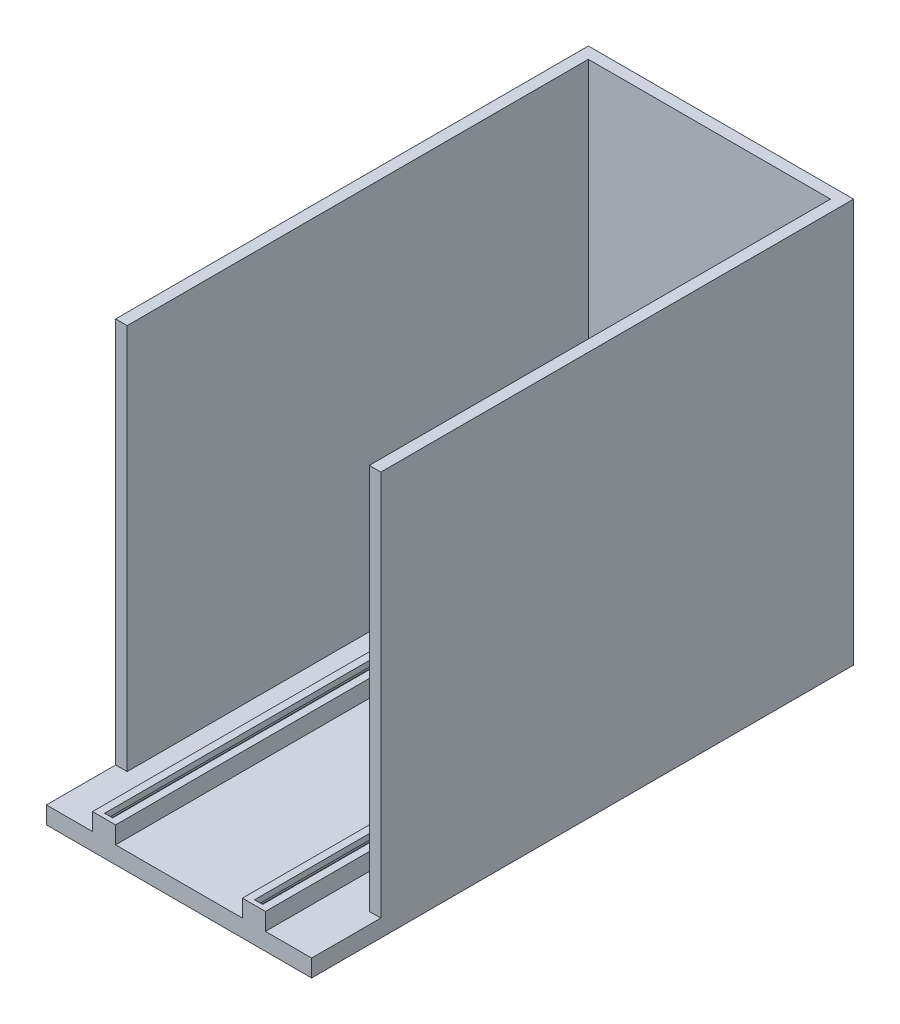
ISO-10303-21;
HEADER;
FILE_DESCRIPTION(('STEP AP214'),'2;1');
FILE_NAME('part.step','',(''),(''),'','','');
FILE_SCHEMA(('AUTOMOTIVE_DESIGN { 1 0 10303 214 1 1 1 1 }'));
ENDSEC;
DATA;
#1=APPLICATION_CONTEXT('core data for automotive mechanical design processes');
#2=APPLICATION_PROTOCOL_DEFINITION('international standard','automotive_design',2000,#1);
#3=PRODUCT_CONTEXT('',#1,'mechanical');
#4=PRODUCT('Part','Part','',(#3));
#5=PRODUCT_RELATED_PRODUCT_CATEGORY('part','',(#4));
#6=PRODUCT_DEFINITION_FORMATION('','',#4);
#7=PRODUCT_DEFINITION_CONTEXT('part definition',#1,'design');
#8=PRODUCT_DEFINITION('design','',#6,#7);
#9=PRODUCT_DEFINITION_SHAPE('','',#8);
#10=(LENGTH_UNIT() NAMED_UNIT(*) SI_UNIT(.MILLI.,.METRE.));
#11=(NAMED_UNIT(*) PLANE_ANGLE_UNIT() SI_UNIT($,.RADIAN.));
#12=(NAMED_UNIT(*) SI_UNIT($,.STERADIAN.) SOLID_ANGLE_UNIT());
#13=UNCERTAINTY_MEASURE_WITH_UNIT(LENGTH_MEASURE(1.E-05),#10,'distance_accuracy_value','');
#14=(GEOMETRIC_REPRESENTATION_CONTEXT(3) GLOBAL_UNCERTAINTY_ASSIGNED_CONTEXT((#13)) GLOBAL_UNIT_ASSIGNED_CONTEXT((#10,
#11,#12)) REPRESENTATION_CONTEXT('',''));
#15=CARTESIAN_POINT('',(0.,0.,0.));
#16=DIRECTION('',(0.,0.,1.));
#17=DIRECTION('',(1.,0.,0.));
#18=AXIS2_PLACEMENT_3D('',#15,#16,#17);
#19=CARTESIAN_POINT('',(90.1700000000001,38.1,-204.47));
#20=DIRECTION('',(0.,0.,-1.));
#21=DIRECTION('',(-1.,0.,0.));
#22=AXIS2_PLACEMENT_3D('',#19,#20,#21);
#23=PLANE('',#22);
#24=DIRECTION('',(-1.,0.,0.));
#25=VECTOR('',#24,1.);
#26=CARTESIAN_POINT('',(78.105,31.75,-204.47));
#27=LINE('',#26,#25);
#28=CARTESIAN_POINT('',(78.105,31.7499999999999,-204.47));
#29=VERTEX_POINT('',#28);
#30=CARTESIAN_POINT('',(74.9299999999999,31.75,-204.47));
#31=VERTEX_POINT('',#30);
#32=EDGE_CURVE('E265',#29,#31,#27,.T.);
#33=ORIENTED_EDGE('',*,*,#32,.T.);
#34=DIRECTION('',(0.,-1.,0.));
#35=VECTOR('',#34,1.);
#36=CARTESIAN_POINT('',(74.9299999999999,38.1,-204.47));
#37=LINE('',#36,#35);
#38=CARTESIAN_POINT('',(74.9299999999999,26.67,-204.47));
#39=VERTEX_POINT('',#38);
#40=EDGE_CURVE('E320',#31,#39,#37,.T.);
#41=ORIENTED_EDGE('',*,*,#40,.T.);
#42=DIRECTION('',(1.,0.,0.));
#43=VECTOR('',#42,1.);
#44=CARTESIAN_POINT('',(90.1700000000001,26.67,-204.47));
#45=LINE('',#44,#43);
#46=CARTESIAN_POINT('',(90.1700000000001,26.67,-204.47));
#47=VERTEX_POINT('',#46);
#48=EDGE_CURVE('E301',#39,#47,#45,.T.);
#49=ORIENTED_EDGE('',*,*,#48,.T.);
#50=DIRECTION('',(0.,-1.,0.));
#51=VECTOR('',#50,1.);
#52=CARTESIAN_POINT('',(90.1700000000001,38.1,-204.47));
#53=LINE('',#52,#51);
#54=CARTESIAN_POINT('',(90.1700000000001,31.75,-204.47));
#55=VERTEX_POINT('',#54);
#56=EDGE_CURVE('E306',#55,#47,#53,.T.);
#57=ORIENTED_EDGE('',*,*,#56,.F.);
#58=DIRECTION('',(1.,0.,0.));
#59=VECTOR('',#58,1.);
#60=CARTESIAN_POINT('',(86.9950000000001,31.75,-204.47));
#61=LINE('',#60,#59);
#62=CARTESIAN_POINT('',(86.9950000000001,31.75,-204.47));
#63=VERTEX_POINT('',#62);
#64=EDGE_CURVE('E299',#63,#55,#61,.T.);
#65=ORIENTED_EDGE('',*,*,#64,.F.);
#66=DIRECTION('',(0.,1.,0.));
#67=VECTOR('',#66,1.);
#68=CARTESIAN_POINT('',(86.9950000000001,38.1,-204.47));
#69=LINE('',#68,#67);
#70=CARTESIAN_POINT('',(86.9950000000001,38.1,-204.47));
#71=VERTEX_POINT('',#70);
#72=EDGE_CURVE('E289',#63,#71,#69,.T.);
#73=ORIENTED_EDGE('',*,*,#72,.T.);
#74=DIRECTION('',(1.,0.,0.));
#75=VECTOR('',#74,1.);
#76=CARTESIAN_POINT('',(90.1700000000001,38.1,-204.47));
#77=LINE('',#76,#75);
#78=CARTESIAN_POINT('',(78.105,38.1,-204.47));
#79=VERTEX_POINT('',#78);
#80=EDGE_CURVE('E55',#79,#71,#77,.T.);
#81=ORIENTED_EDGE('',*,*,#80,.F.);
#82=DIRECTION('',(0.,1.,0.));
#83=VECTOR('',#82,1.);
#84=CARTESIAN_POINT('',(78.105,38.1,-204.47));
#85=LINE('',#84,#83);
#86=EDGE_CURVE('E50',#29,#79,#85,.T.);
#87=ORIENTED_EDGE('',*,*,#86,.F.);
#88=EDGE_LOOP('',(#33,#41,#49,#57,#65,#73,#81,#87));
#89=FACE_BOUND('',#88,.T.);
#90=ADVANCED_FACE('F35',(#89),#23,.F.);
#91=CARTESIAN_POINT('',(74.9299999999999,38.1,-204.47));
#92=DIRECTION('',(-1.,0.,0.));
#93=DIRECTION('',(0.,0.,1.));
#94=AXIS2_PLACEMENT_3D('',#91,#92,#93);
#95=PLANE('',#94);
#96=DIRECTION('',(0.,0.,-1.));
#97=VECTOR('',#96,1.);
#98=CARTESIAN_POINT('',(74.93,31.75,-204.47));
#99=LINE('',#98,#97);
#100=CARTESIAN_POINT('',(74.9299999999999,31.7499999999999,293.37));
#101=VERTEX_POINT('',#100);
#102=EDGE_CURVE('E276',#101,#31,#99,.T.);
#103=ORIENTED_EDGE('',*,*,#102,.F.);
#104=DIRECTION('',(0.,-1.,0.));
#105=VECTOR('',#104,1.);
#106=CARTESIAN_POINT('',(74.9299999999999,38.1,293.37));
#107=LINE('',#106,#105);
#108=CARTESIAN_POINT('',(74.9299999999999,26.67,293.37));
#109=VERTEX_POINT('',#108);
#110=EDGE_CURVE('E261',#101,#109,#107,.T.);
#111=ORIENTED_EDGE('',*,*,#110,.T.);
#112=DIRECTION('',(0.,0.,-1.));
#113=VECTOR('',#112,1.);
#114=CARTESIAN_POINT('',(74.9299999999999,26.67,-204.47));
#115=LINE('',#114,#113);
#116=EDGE_CURVE('E309',#109,#39,#115,.T.);
#117=ORIENTED_EDGE('',*,*,#116,.T.);
#118=ORIENTED_EDGE('',*,*,#40,.F.);
#119=EDGE_LOOP('',(#103,#111,#117,#118));
#120=FACE_BOUND('',#119,.T.);
#121=ADVANCED_FACE('F578',(#120),#95,.F.);
#122=CARTESIAN_POINT('',(74.9299999999999,38.1,293.37));
#123=DIRECTION('',(0.,0.,1.));
#124=DIRECTION('',(1.,0.,0.));
#125=AXIS2_PLACEMENT_3D('',#122,#123,#124);
#126=PLANE('',#125);
#127=DIRECTION('',(-1.,0.,0.));
#128=VECTOR('',#127,1.);
#129=CARTESIAN_POINT('',(78.1050000000001,31.7499999999999,293.37));
#130=LINE('',#129,#128);
#131=CARTESIAN_POINT('',(78.1050000000001,31.7499999999999,293.37));
#132=VERTEX_POINT('',#131);
#133=EDGE_CURVE('E253',#132,#101,#130,.T.);
#134=ORIENTED_EDGE('',*,*,#133,.F.);
#135=DIRECTION('',(0.,-1.,0.));
#136=VECTOR('',#135,1.);
#137=CARTESIAN_POINT('',(78.1050000000001,31.7499999999999,293.37));
#138=LINE('',#137,#136);
#139=CARTESIAN_POINT('',(78.1050000000001,38.1,293.37));
#140=VERTEX_POINT('',#139);
#141=EDGE_CURVE('E258',#140,#132,#138,.T.);
#142=ORIENTED_EDGE('',*,*,#141,.F.);
#143=DIRECTION('',(-1.,0.,0.));
#144=VECTOR('',#143,1.);
#145=CARTESIAN_POINT('',(74.9299999999999,38.1,293.37));
#146=LINE('',#145,#144);
#147=CARTESIAN_POINT('',(86.9950000000001,38.1,293.37));
#148=VERTEX_POINT('',#147);
#149=EDGE_CURVE('E303',#148,#140,#146,.T.);
#150=ORIENTED_EDGE('',*,*,#149,.F.);
#151=DIRECTION('',(0.,-1.,0.));
#152=VECTOR('',#151,1.);
#153=CARTESIAN_POINT('',(86.9950000000001,31.7499999999999,293.37));
#154=LINE('',#153,#152);
#155=CARTESIAN_POINT('',(86.9950000000001,31.7499999999999,293.37));
#156=VERTEX_POINT('',#155);
#157=EDGE_CURVE('E283',#148,#156,#154,.T.);
#158=ORIENTED_EDGE('',*,*,#157,.T.);
#159=DIRECTION('',(1.,0.,0.));
#160=VECTOR('',#159,1.);
#161=CARTESIAN_POINT('',(86.9950000000001,31.7499999999999,293.37));
#162=LINE('',#161,#160);
#163=CARTESIAN_POINT('',(90.1700000000001,31.7499999999999,293.37));
#164=VERTEX_POINT('',#163);
#165=EDGE_CURVE('E294',#156,#164,#162,.T.);
#166=ORIENTED_EDGE('',*,*,#165,.T.);
#167=DIRECTION('',(0.,-1.,0.));
#168=VECTOR('',#167,1.);
#169=CARTESIAN_POINT('',(90.1700000000001,38.1,293.37));
#170=LINE('',#169,#168);
#171=CARTESIAN_POINT('',(90.1700000000001,26.67,293.37));
#172=VERTEX_POINT('',#171);
#173=EDGE_CURVE('E317',#164,#172,#170,.T.);
#174=ORIENTED_EDGE('',*,*,#173,.T.);
#175=DIRECTION('',(-1.,0.,0.));
#176=VECTOR('',#175,1.);
#177=CARTESIAN_POINT('',(74.9299999999999,26.67,293.37));
#178=LINE('',#177,#176);
#179=EDGE_CURVE('E312',#172,#109,#178,.T.);
#180=ORIENTED_EDGE('',*,*,#179,.T.);
#181=ORIENTED_EDGE('',*,*,#110,.F.);
#182=EDGE_LOOP('',(#134,#142,#150,#158,#166,#174,#180,#181));
#183=FACE_BOUND('',#182,.T.);
#184=ADVANCED_FACE('F255',(#183),#126,.F.);
#185=CARTESIAN_POINT('',(-90.1700000000001,38.1,-204.47));
#186=DIRECTION('',(0.,0.,1.));
#187=DIRECTION('',(1.,0.,0.));
#188=AXIS2_PLACEMENT_3D('',#185,#186,#187);
#189=PLANE('',#188);
#190=DIRECTION('',(1.,0.,0.));
#191=VECTOR('',#190,1.);
#192=CARTESIAN_POINT('',(-78.1050000000001,31.75,-204.47));
#193=LINE('',#192,#191);
#194=CARTESIAN_POINT('',(-78.1050000000001,31.7499999999999,-204.47));
#195=VERTEX_POINT('',#194);
#196=CARTESIAN_POINT('',(-74.9299999999999,31.75,-204.47));
#197=VERTEX_POINT('',#196);
#198=EDGE_CURVE('E368',#195,#197,#193,.T.);
#199=ORIENTED_EDGE('',*,*,#198,.F.);
#200=DIRECTION('',(0.,1.,0.));
#201=VECTOR('',#200,1.);
#202=CARTESIAN_POINT('',(-78.1050000000001,38.1,-204.47));
#203=LINE('',#202,#201);
#204=CARTESIAN_POINT('',(-78.1050000000001,38.1,-204.47));
#205=VERTEX_POINT('',#204);
#206=EDGE_CURVE('E359',#195,#205,#203,.T.);
#207=ORIENTED_EDGE('',*,*,#206,.T.);
#208=DIRECTION('',(-1.,0.,0.));
#209=VECTOR('',#208,1.);
#210=CARTESIAN_POINT('',(-90.1700000000001,38.1,-204.47));
#211=LINE('',#210,#209);
#212=CARTESIAN_POINT('',(-86.9950000000001,38.1,-204.47));
#213=VERTEX_POINT('',#212);
#214=EDGE_CURVE('E389',#205,#213,#211,.T.);
#215=ORIENTED_EDGE('',*,*,#214,.T.);
#216=DIRECTION('',(0.,1.,0.));
#217=VECTOR('',#216,1.);
#218=CARTESIAN_POINT('',(-86.9950000000001,38.1,-204.47));
#219=LINE('',#218,#217);
#220=CARTESIAN_POINT('',(-86.9950000000001,31.75,-204.47));
#221=VERTEX_POINT('',#220);
#222=EDGE_CURVE('E377',#221,#213,#219,.T.);
#223=ORIENTED_EDGE('',*,*,#222,.F.);
#224=DIRECTION('',(-1.,0.,0.));
#225=VECTOR('',#224,1.);
#226=CARTESIAN_POINT('',(-86.9950000000001,31.75,-204.47));
#227=LINE('',#226,#225);
#228=CARTESIAN_POINT('',(-90.1700000000001,31.75,-204.47));
#229=VERTEX_POINT('',#228);
#230=EDGE_CURVE('E382',#221,#229,#227,.T.);
#231=ORIENTED_EDGE('',*,*,#230,.T.);
#232=DIRECTION('',(0.,-1.,0.));
#233=VECTOR('',#232,1.);
#234=CARTESIAN_POINT('',(-90.1700000000001,38.1,-204.47));
#235=LINE('',#234,#233);
#236=CARTESIAN_POINT('',(-90.1700000000001,26.67,-204.47));
#237=VERTEX_POINT('',#236);
#238=EDGE_CURVE('E410',#229,#237,#235,.T.);
#239=ORIENTED_EDGE('',*,*,#238,.T.);
#240=DIRECTION('',(-1.,0.,0.));
#241=VECTOR('',#240,1.);
#242=CARTESIAN_POINT('',(-90.1700000000001,26.67,-204.47));
#243=LINE('',#242,#241);
#244=CARTESIAN_POINT('',(-74.9299999999999,26.67,-204.47));
#245=VERTEX_POINT('',#244);
#246=EDGE_CURVE('E388',#245,#237,#243,.T.);
#247=ORIENTED_EDGE('',*,*,#246,.F.);
#248=DIRECTION('',(0.,-1.,0.));
#249=VECTOR('',#248,1.);
#250=CARTESIAN_POINT('',(-74.9299999999999,38.1,-204.47));
#251=LINE('',#250,#249);
#252=EDGE_CURVE('E394',#197,#245,#251,.T.);
#253=ORIENTED_EDGE('',*,*,#252,.F.);
#254=EDGE_LOOP('',(#199,#207,#215,#223,#231,#239,#247,#253));
#255=FACE_BOUND('',#254,.T.);
#256=ADVANCED_FACE('F638',(#255),#189,.T.);
#257=CARTESIAN_POINT('',(-90.1700000000001,38.1,-204.47));
#258=DIRECTION('',(1.,0.,0.));
#259=DIRECTION('',(0.,0.,-1.));
#260=AXIS2_PLACEMENT_3D('',#257,#258,#259);
#261=PLANE('',#260);
#262=ORIENTED_EDGE('',*,*,#238,.F.);
#263=DIRECTION('',(0.,0.,-1.));
#264=VECTOR('',#263,1.);
#265=CARTESIAN_POINT('',(-90.1700000000001,31.75,-204.47));
#266=LINE('',#265,#264);
#267=CARTESIAN_POINT('',(-90.1700000000001,31.7499999999999,293.37));
#268=VERTEX_POINT('',#267);
#269=EDGE_CURVE('E371',#268,#229,#266,.T.);
#270=ORIENTED_EDGE('',*,*,#269,.F.);
#271=DIRECTION('',(0.,-1.,0.));
#272=VECTOR('',#271,1.);
#273=CARTESIAN_POINT('',(-90.1700000000001,38.1,293.37));
#274=LINE('',#273,#272);
#275=CARTESIAN_POINT('',(-90.1700000000001,26.67,293.37));
#276=VERTEX_POINT('',#275);
#277=EDGE_CURVE('E408',#268,#276,#274,.T.);
#278=ORIENTED_EDGE('',*,*,#277,.T.);
#279=DIRECTION('',(0.,0.,1.));
#280=VECTOR('',#279,1.);
#281=CARTESIAN_POINT('',(-90.1700000000001,26.67,-204.47));
#282=LINE('',#281,#280);
#283=EDGE_CURVE('E397',#237,#276,#282,.T.);
#284=ORIENTED_EDGE('',*,*,#283,.F.);
#285=EDGE_LOOP('',(#262,#270,#278,#284));
#286=FACE_BOUND('',#285,.T.);
#287=ADVANCED_FACE('F634',(#286),#261,.T.);
#288=CARTESIAN_POINT('',(-74.9299999999999,38.1,293.37));
#289=DIRECTION('',(0.,0.,-1.));
#290=DIRECTION('',(-1.,0.,0.));
#291=AXIS2_PLACEMENT_3D('',#288,#289,#290);
#292=PLANE('',#291);
#293=DIRECTION('',(1.,0.,0.));
#294=VECTOR('',#293,1.);
#295=CARTESIAN_POINT('',(-78.105,31.7499999999999,293.37));
#296=LINE('',#295,#294);
#297=CARTESIAN_POINT('',(-78.105,31.7499999999999,293.37));
#298=VERTEX_POINT('',#297);
#299=CARTESIAN_POINT('',(-74.93,31.7499999999999,293.37));
#300=VERTEX_POINT('',#299);
#301=EDGE_CURVE('E364',#298,#300,#296,.T.);
#302=ORIENTED_EDGE('',*,*,#301,.T.);
#303=DIRECTION('',(0.,-1.,0.));
#304=VECTOR('',#303,1.);
#305=CARTESIAN_POINT('',(-74.9299999999999,38.1,293.37));
#306=LINE('',#305,#304);
#307=CARTESIAN_POINT('',(-74.9299999999999,26.67,293.37));
#308=VERTEX_POINT('',#307);
#309=EDGE_CURVE('E406',#300,#308,#306,.T.);
#310=ORIENTED_EDGE('',*,*,#309,.T.);
#311=DIRECTION('',(1.,0.,0.));
#312=VECTOR('',#311,1.);
#313=CARTESIAN_POINT('',(-74.9299999999999,26.67,293.37));
#314=LINE('',#313,#312);
#315=EDGE_CURVE('E400',#276,#308,#314,.T.);
#316=ORIENTED_EDGE('',*,*,#315,.F.);
#317=ORIENTED_EDGE('',*,*,#277,.F.);
#318=DIRECTION('',(-1.,0.,0.));
#319=VECTOR('',#318,1.);
#320=CARTESIAN_POINT('',(-86.9950000000001,31.7499999999999,293.37));
#321=LINE('',#320,#319);
#322=CARTESIAN_POINT('',(-86.9950000000001,31.7499999999999,293.37));
#323=VERTEX_POINT('',#322);
#324=EDGE_CURVE('E386',#323,#268,#321,.T.);
#325=ORIENTED_EDGE('',*,*,#324,.F.);
#326=DIRECTION('',(0.,-1.,0.));
#327=VECTOR('',#326,1.);
#328=CARTESIAN_POINT('',(-86.9950000000001,31.7499999999999,293.37));
#329=LINE('',#328,#327);
#330=CARTESIAN_POINT('',(-86.9950000000001,38.1,293.37));
#331=VERTEX_POINT('',#330);
#332=EDGE_CURVE('E372',#331,#323,#329,.T.);
#333=ORIENTED_EDGE('',*,*,#332,.F.);
#334=DIRECTION('',(1.,0.,0.));
#335=VECTOR('',#334,1.);
#336=CARTESIAN_POINT('',(-74.9299999999999,38.1,293.37));
#337=LINE('',#336,#335);
#338=CARTESIAN_POINT('',(-78.1050000000001,38.1,293.37));
#339=VERTEX_POINT('',#338);
#340=EDGE_CURVE('E391',#331,#339,#337,.T.);
#341=ORIENTED_EDGE('',*,*,#340,.T.);
#342=DIRECTION('',(0.,-1.,0.));
#343=VECTOR('',#342,1.);
#344=CARTESIAN_POINT('',(-78.105,31.7499999999999,293.37));
#345=LINE('',#344,#343);
#346=EDGE_CURVE('E354',#339,#298,#345,.T.);
#347=ORIENTED_EDGE('',*,*,#346,.T.);
#348=EDGE_LOOP('',(#302,#310,#316,#317,#325,#333,#341,#347));
#349=FACE_BOUND('',#348,.T.);
#350=ADVANCED_FACE('F631',(#349),#292,.T.);
#351=CARTESIAN_POINT('',(0.,19.05,0.));
#352=DIRECTION('',(0.,-1.,0.));
#353=DIRECTION('',(0.,0.,-1.));
#354=AXIS2_PLACEMENT_3D('',#351,#352,#353);
#355=PLANE('',#354);
#356=DIRECTION('',(1.,0.,0.));
#357=VECTOR('',#356,1.);
#358=CARTESIAN_POINT('',(69.8500000000001,19.05,-209.55));
#359=LINE('',#358,#357);
#360=CARTESIAN_POINT('',(69.8500000000001,19.05,-209.55));
#361=VERTEX_POINT('',#360);
#362=CARTESIAN_POINT('',(95.2500000000001,19.05,-209.55));
#363=VERTEX_POINT('',#362);
#364=EDGE_CURVE('E337',#361,#363,#359,.T.);
#365=ORIENTED_EDGE('',*,*,#364,.T.);
#366=DIRECTION('',(0.,0.,1.));
#367=VECTOR('',#366,1.);
#368=CARTESIAN_POINT('',(95.2500000000001,19.05,-209.55));
#369=LINE('',#368,#367);
#370=CARTESIAN_POINT('',(95.25,19.05,298.45));
#371=VERTEX_POINT('',#370);
#372=EDGE_CURVE('E334',#363,#371,#369,.T.);
#373=ORIENTED_EDGE('',*,*,#372,.T.);
#374=DIRECTION('',(1.,0.,0.));
#375=VECTOR('',#374,1.);
#376=CARTESIAN_POINT('',(-146.05,19.05,298.45));
#377=LINE('',#376,#375);
#378=CARTESIAN_POINT('',(146.05,19.05,298.45));
#379=VERTEX_POINT('',#378);
#380=EDGE_CURVE('E503',#371,#379,#377,.T.);
#381=ORIENTED_EDGE('',*,*,#380,.T.);
#382=DIRECTION('',(0.,0.,-1.));
#383=VECTOR('',#382,1.);
#384=CARTESIAN_POINT('',(146.05,19.05,298.45));
#385=LINE('',#384,#383);
#386=CARTESIAN_POINT('',(146.05,19.05,222.25));
#387=VERTEX_POINT('',#386);
#388=EDGE_CURVE('E498',#379,#387,#385,.T.);
#389=ORIENTED_EDGE('',*,*,#388,.T.);
#390=DIRECTION('',(1.,0.,0.));
#391=VECTOR('',#390,1.);
#392=CARTESIAN_POINT('',(146.05,19.05,222.25));
#393=LINE('',#392,#391);
#394=CARTESIAN_POINT('',(133.35,19.05,222.25));
#395=VERTEX_POINT('',#394);
#396=EDGE_CURVE('E450',#395,#387,#393,.T.);
#397=ORIENTED_EDGE('',*,*,#396,.F.);
#398=DIRECTION('',(0.,0.,1.));
#399=VECTOR('',#398,1.);
#400=CARTESIAN_POINT('',(133.35,19.05,222.25));
#401=LINE('',#400,#399);
#402=CARTESIAN_POINT('',(133.35,19.05,-285.75));
#403=VERTEX_POINT('',#402);
#404=EDGE_CURVE('E475',#403,#395,#401,.T.);
#405=ORIENTED_EDGE('',*,*,#404,.F.);
#406=DIRECTION('',(1.,0.,0.));
#407=VECTOR('',#406,1.);
#408=CARTESIAN_POINT('',(133.35,19.05,-285.75));
#409=LINE('',#408,#407);
#410=CARTESIAN_POINT('',(-133.35,19.05,-285.75));
#411=VERTEX_POINT('',#410);
#412=EDGE_CURVE('E472',#411,#403,#409,.T.);
#413=ORIENTED_EDGE('',*,*,#412,.F.);
#414=DIRECTION('',(0.,0.,-1.));
#415=VECTOR('',#414,1.);
#416=CARTESIAN_POINT('',(-133.35,19.05,-285.75));
#417=LINE('',#416,#415);
#418=CARTESIAN_POINT('',(-133.35,19.05,222.25));
#419=VERTEX_POINT('',#418);
#420=EDGE_CURVE('E469',#419,#411,#417,.T.);
#421=ORIENTED_EDGE('',*,*,#420,.F.);
#422=DIRECTION('',(1.,0.,0.));
#423=VECTOR('',#422,1.);
#424=CARTESIAN_POINT('',(-133.35,19.05,222.25));
#425=LINE('',#424,#423);
#426=CARTESIAN_POINT('',(-146.05,19.05,222.25));
#427=VERTEX_POINT('',#426);
#428=EDGE_CURVE('E445',#427,#419,#425,.T.);
#429=ORIENTED_EDGE('',*,*,#428,.F.);
#430=DIRECTION('',(0.,0.,1.));
#431=VECTOR('',#430,1.);
#432=CARTESIAN_POINT('',(-146.05,19.05,298.45));
#433=LINE('',#432,#431);
#434=CARTESIAN_POINT('',(-146.05,19.05,298.45));
#435=VERTEX_POINT('',#434);
#436=EDGE_CURVE('E500',#427,#435,#433,.T.);
#437=ORIENTED_EDGE('',*,*,#436,.T.);
#438=CARTESIAN_POINT('',(-95.2500000000001,19.05,298.45));
#439=VERTEX_POINT('',#438);
#440=EDGE_CURVE('E504',#435,#439,#377,.T.);
#441=ORIENTED_EDGE('',*,*,#440,.T.);
#442=DIRECTION('',(0.,0.,1.));
#443=VECTOR('',#442,1.);
#444=CARTESIAN_POINT('',(-95.2500000000001,19.05,-209.55));
#445=LINE('',#444,#443);
#446=CARTESIAN_POINT('',(-95.2500000000001,19.05,-209.55));
#447=VERTEX_POINT('',#446);
#448=EDGE_CURVE('E430',#447,#439,#445,.T.);
#449=ORIENTED_EDGE('',*,*,#448,.F.);
#450=DIRECTION('',(-1.,0.,0.));
#451=VECTOR('',#450,1.);
#452=CARTESIAN_POINT('',(-69.8500000000001,19.05,-209.55));
#453=LINE('',#452,#451);
#454=CARTESIAN_POINT('',(-69.8500000000001,19.05,-209.55));
#455=VERTEX_POINT('',#454);
#456=EDGE_CURVE('E427',#455,#447,#453,.T.);
#457=ORIENTED_EDGE('',*,*,#456,.F.);
#458=DIRECTION('',(0.,0.,-1.));
#459=VECTOR('',#458,1.);
#460=CARTESIAN_POINT('',(-69.8500000000001,19.05,298.45));
#461=LINE('',#460,#459);
#462=CARTESIAN_POINT('',(-69.8500000000001,19.05,298.45));
#463=VERTEX_POINT('',#462);
#464=EDGE_CURVE('E424',#463,#455,#461,.T.);
#465=ORIENTED_EDGE('',*,*,#464,.F.);
#466=CARTESIAN_POINT('',(69.8500000000001,19.05,298.45));
#467=VERTEX_POINT('',#466);
#468=EDGE_CURVE('E507',#463,#467,#377,.T.);
#469=ORIENTED_EDGE('',*,*,#468,.T.);
#470=DIRECTION('',(0.,0.,-1.));
#471=VECTOR('',#470,1.);
#472=CARTESIAN_POINT('',(69.8500000000001,19.05,298.45));
#473=LINE('',#472,#471);
#474=EDGE_CURVE('E339',#467,#361,#473,.T.);
#475=ORIENTED_EDGE('',*,*,#474,.T.);
#476=EDGE_LOOP('',(#365,#373,#381,#389,#397,#405,#413,#421,#429,#437,#441,#449,#457,#465,#469,#475));
#477=FACE_BOUND('',#476,.T.);
#478=ADVANCED_FACE('F544',(#477),#355,.F.);
#479=CARTESIAN_POINT('',(146.05,19.05,298.45));
#480=DIRECTION('',(-1.,0.,0.));
#481=DIRECTION('',(0.,0.,1.));
#482=AXIS2_PLACEMENT_3D('',#479,#480,#481);
#483=PLANE('',#482);
#484=DIRECTION('',(0.,0.,-1.));
#485=VECTOR('',#484,1.);
#486=CARTESIAN_POINT('',(146.05,0.,298.45));
#487=LINE('',#486,#485);
#488=CARTESIAN_POINT('',(146.05,0.,298.45));
#489=VERTEX_POINT('',#488);
#490=CARTESIAN_POINT('',(146.05,0.,-298.45));
#491=VERTEX_POINT('',#490);
#492=EDGE_CURVE('E497',#489,#491,#487,.T.);
#493=ORIENTED_EDGE('',*,*,#492,.T.);
#494=DIRECTION('',(0.,-1.,0.));
#495=VECTOR('',#494,1.);
#496=CARTESIAN_POINT('',(146.05,19.05,-298.45));
#497=LINE('',#496,#495);
#498=CARTESIAN_POINT('',(146.05,444.5,-298.45));
#499=VERTEX_POINT('',#498);
#500=EDGE_CURVE('E11',#499,#491,#497,.T.);
#501=ORIENTED_EDGE('',*,*,#500,.F.);
#502=DIRECTION('',(0.,0.,-1.));
#503=VECTOR('',#502,1.);
#504=CARTESIAN_POINT('',(146.05,444.5,-298.45));
#505=LINE('',#504,#503);
#506=CARTESIAN_POINT('',(146.05,444.5,222.25));
#507=VERTEX_POINT('',#506);
#508=EDGE_CURVE('E458',#507,#499,#505,.T.);
#509=ORIENTED_EDGE('',*,*,#508,.F.);
#510=DIRECTION('',(0.,-1.,0.));
#511=VECTOR('',#510,1.);
#512=CARTESIAN_POINT('',(146.05,444.5,222.25));
#513=LINE('',#512,#511);
#514=EDGE_CURVE('E482',#507,#387,#513,.T.);
#515=ORIENTED_EDGE('',*,*,#514,.T.);
#516=ORIENTED_EDGE('',*,*,#388,.F.);
#517=DIRECTION('',(0.,-1.,0.));
#518=VECTOR('',#517,1.);
#519=CARTESIAN_POINT('',(146.05,19.05,298.45));
#520=LINE('',#519,#518);
#521=EDGE_CURVE('E506',#379,#489,#520,.T.);
#522=ORIENTED_EDGE('',*,*,#521,.T.);
#523=EDGE_LOOP('',(#493,#501,#509,#515,#516,#522));
#524=FACE_BOUND('',#523,.T.);
#525=ADVANCED_FACE('F37',(#524),#483,.F.);
#526=CARTESIAN_POINT('',(-146.05,19.05,-298.45));
#527=DIRECTION('',(0.,0.,1.));
#528=DIRECTION('',(1.,0.,0.));
#529=AXIS2_PLACEMENT_3D('',#526,#527,#528);
#530=PLANE('',#529);
#531=DIRECTION('',(-1.,0.,0.));
#532=VECTOR('',#531,1.);
#533=CARTESIAN_POINT('',(-146.05,0.,-298.45));
#534=LINE('',#533,#532);
#535=CARTESIAN_POINT('',(-146.05,0.,-298.45));
#536=VERTEX_POINT('',#535);
#537=EDGE_CURVE('E510',#491,#536,#534,.T.);
#538=ORIENTED_EDGE('',*,*,#537,.T.);
#539=DIRECTION('',(0.,-1.,0.));
#540=VECTOR('',#539,1.);
#541=CARTESIAN_POINT('',(-146.05,19.05,-298.45));
#542=LINE('',#541,#540);
#543=CARTESIAN_POINT('',(-146.05,444.5,-298.45));
#544=VERTEX_POINT('',#543);
#545=EDGE_CURVE('E43',#544,#536,#542,.T.);
#546=ORIENTED_EDGE('',*,*,#545,.F.);
#547=DIRECTION('',(-1.,0.,0.));
#548=VECTOR('',#547,1.);
#549=CARTESIAN_POINT('',(-146.05,444.5,-298.45));
#550=LINE('',#549,#548);
#551=EDGE_CURVE('E461',#499,#544,#550,.T.);
#552=ORIENTED_EDGE('',*,*,#551,.F.);
#553=ORIENTED_EDGE('',*,*,#500,.T.);
#554=EDGE_LOOP('',(#538,#546,#552,#553));
#555=FACE_BOUND('',#554,.T.);
#556=ADVANCED_FACE('F530',(#555),#530,.F.);
#557=CARTESIAN_POINT('',(-146.05,19.05,298.45));
#558=DIRECTION('',(1.,0.,0.));
#559=DIRECTION('',(0.,0.,-1.));
#560=AXIS2_PLACEMENT_3D('',#557,#558,#559);
#561=PLANE('',#560);
#562=ORIENTED_EDGE('',*,*,#436,.F.);
#563=DIRECTION('',(0.,-1.,0.));
#564=VECTOR('',#563,1.);
#565=CARTESIAN_POINT('',(-146.05,444.5,222.25));
#566=LINE('',#565,#564);
#567=CARTESIAN_POINT('',(-146.05,444.5,222.25));
#568=VERTEX_POINT('',#567);
#569=EDGE_CURVE('E466',#568,#427,#566,.T.);
#570=ORIENTED_EDGE('',*,*,#569,.F.);
#571=DIRECTION('',(0.,0.,1.));
#572=VECTOR('',#571,1.);
#573=CARTESIAN_POINT('',(-146.05,444.5,222.25));
#574=LINE('',#573,#572);
#575=EDGE_CURVE('E464',#544,#568,#574,.T.);
#576=ORIENTED_EDGE('',*,*,#575,.F.);
#577=ORIENTED_EDGE('',*,*,#545,.T.);
#578=DIRECTION('',(0.,0.,1.));
#579=VECTOR('',#578,1.);
#580=CARTESIAN_POINT('',(-146.05,0.,298.45));
#581=LINE('',#580,#579);
#582=CARTESIAN_POINT('',(-146.05,0.,298.45));
#583=VERTEX_POINT('',#582);
#584=EDGE_CURVE('E513',#536,#583,#581,.T.);
#585=ORIENTED_EDGE('',*,*,#584,.T.);
#586=DIRECTION('',(0.,-1.,0.));
#587=VECTOR('',#586,1.);
#588=CARTESIAN_POINT('',(-146.05,19.05,298.45));
#589=LINE('',#588,#587);
#590=EDGE_CURVE('E518',#435,#583,#589,.T.);
#591=ORIENTED_EDGE('',*,*,#590,.F.);
#592=EDGE_LOOP('',(#562,#570,#576,#577,#585,#591));
#593=FACE_BOUND('',#592,.T.);
#594=ADVANCED_FACE('F523',(#593),#561,.F.);
#595=CARTESIAN_POINT('',(-146.05,19.05,298.45));
#596=DIRECTION('',(0.,0.,-1.));
#597=DIRECTION('',(-1.,0.,0.));
#598=AXIS2_PLACEMENT_3D('',#595,#596,#597);
#599=PLANE('',#598);
#600=ORIENTED_EDGE('',*,*,#468,.F.);
#601=DIRECTION('',(0.,-1.,0.));
#602=VECTOR('',#601,1.);
#603=CARTESIAN_POINT('',(-69.8500000000001,26.67,298.45));
#604=LINE('',#603,#602);
#605=CARTESIAN_POINT('',(-69.85,38.1,298.45));
#606=VERTEX_POINT('',#605);
#607=EDGE_CURVE('E442',#606,#463,#604,.T.);
#608=ORIENTED_EDGE('',*,*,#607,.F.);
#609=DIRECTION('',(1.,0.,0.));
#610=VECTOR('',#609,1.);
#611=CARTESIAN_POINT('',(-95.25,38.1,298.45));
#612=LINE('',#611,#610);
#613=CARTESIAN_POINT('',(-95.25,38.1,298.45));
#614=VERTEX_POINT('',#613);
#615=EDGE_CURVE('E418',#614,#606,#612,.T.);
#616=ORIENTED_EDGE('',*,*,#615,.F.);
#617=DIRECTION('',(0.,-1.,0.));
#618=VECTOR('',#617,1.);
#619=CARTESIAN_POINT('',(-95.25,26.67,298.45));
#620=LINE('',#619,#618);
#621=EDGE_CURVE('E433',#614,#439,#620,.T.);
#622=ORIENTED_EDGE('',*,*,#621,.T.);
#623=ORIENTED_EDGE('',*,*,#440,.F.);
#624=ORIENTED_EDGE('',*,*,#590,.T.);
#625=DIRECTION('',(1.,0.,0.));
#626=VECTOR('',#625,1.);
#627=CARTESIAN_POINT('',(-146.05,0.,298.45));
#628=LINE('',#627,#626);
#629=EDGE_CURVE('E501',#583,#489,#628,.T.);
#630=ORIENTED_EDGE('',*,*,#629,.T.);
#631=ORIENTED_EDGE('',*,*,#521,.F.);
#632=ORIENTED_EDGE('',*,*,#380,.F.);
#633=DIRECTION('',(0.,-1.,0.));
#634=VECTOR('',#633,1.);
#635=CARTESIAN_POINT('',(95.25,26.67,298.45));
#636=LINE('',#635,#634);
#637=CARTESIAN_POINT('',(95.25,38.1,298.45));
#638=VERTEX_POINT('',#637);
#639=EDGE_CURVE('E350',#638,#371,#636,.T.);
#640=ORIENTED_EDGE('',*,*,#639,.F.);
#641=DIRECTION('',(-1.,0.,0.));
#642=VECTOR('',#641,1.);
#643=CARTESIAN_POINT('',(95.25,38.1,298.45));
#644=LINE('',#643,#642);
#645=CARTESIAN_POINT('',(69.85,38.1,298.45));
#646=VERTEX_POINT('',#645);
#647=EDGE_CURVE('E328',#638,#646,#644,.T.);
#648=ORIENTED_EDGE('',*,*,#647,.T.);
#649=DIRECTION('',(0.,-1.,0.));
#650=VECTOR('',#649,1.);
#651=CARTESIAN_POINT('',(69.8500000000001,26.67,298.45));
#652=LINE('',#651,#650);
#653=EDGE_CURVE('E341',#646,#467,#652,.T.);
#654=ORIENTED_EDGE('',*,*,#653,.T.);
#655=EDGE_LOOP('',(#600,#608,#616,#622,#623,#624,#630,#631,#632,#640,#648,#654));
#656=FACE_BOUND('',#655,.T.);
#657=ADVANCED_FACE('F537',(#656),#599,.F.);
#658=CARTESIAN_POINT('',(0.,0.,0.));
#659=DIRECTION('',(0.,-1.,0.));
#660=DIRECTION('',(0.,0.,-1.));
#661=AXIS2_PLACEMENT_3D('',#658,#659,#660);
#662=PLANE('',#661);
#663=ORIENTED_EDGE('',*,*,#492,.F.);
#664=ORIENTED_EDGE('',*,*,#629,.F.);
#665=ORIENTED_EDGE('',*,*,#584,.F.);
#666=ORIENTED_EDGE('',*,*,#537,.F.);
#667=EDGE_LOOP('',(#663,#664,#665,#666));
#668=FACE_BOUND('',#667,.T.);
#669=ADVANCED_FACE('F534',(#668),#662,.T.);
#670=CARTESIAN_POINT('',(-133.35,444.5,222.25));
#671=DIRECTION('',(0.,0.,-1.));
#672=DIRECTION('',(-1.,0.,0.));
#673=AXIS2_PLACEMENT_3D('',#670,#671,#672);
#674=PLANE('',#673);
#675=ORIENTED_EDGE('',*,*,#428,.T.);
#676=DIRECTION('',(0.,-1.,0.));
#677=VECTOR('',#676,1.);
#678=CARTESIAN_POINT('',(-133.35,444.5,222.25));
#679=LINE('',#678,#677);
#680=CARTESIAN_POINT('',(-133.35,444.5,222.25));
#681=VERTEX_POINT('',#680);
#682=EDGE_CURVE('E494',#681,#419,#679,.T.);
#683=ORIENTED_EDGE('',*,*,#682,.F.);
#684=DIRECTION('',(1.,0.,0.));
#685=VECTOR('',#684,1.);
#686=CARTESIAN_POINT('',(-133.35,444.5,222.25));
#687=LINE('',#686,#685);
#688=EDGE_CURVE('E446',#568,#681,#687,.T.);
#689=ORIENTED_EDGE('',*,*,#688,.F.);
#690=ORIENTED_EDGE('',*,*,#569,.T.);
#691=EDGE_LOOP('',(#675,#683,#689,#690));
#692=FACE_BOUND('',#691,.T.);
#693=ADVANCED_FACE('F562',(#692),#674,.F.);
#694=CARTESIAN_POINT('',(-133.35,444.5,-285.75));
#695=DIRECTION('',(-1.,0.,0.));
#696=DIRECTION('',(0.,0.,1.));
#697=AXIS2_PLACEMENT_3D('',#694,#695,#696);
#698=PLANE('',#697);
#699=ORIENTED_EDGE('',*,*,#420,.T.);
#700=DIRECTION('',(0.,-1.,0.));
#701=VECTOR('',#700,1.);
#702=CARTESIAN_POINT('',(-133.35,444.5,-285.75));
#703=LINE('',#702,#701);
#704=CARTESIAN_POINT('',(-133.35,444.5,-285.75));
#705=VERTEX_POINT('',#704);
#706=EDGE_CURVE('E491',#705,#411,#703,.T.);
#707=ORIENTED_EDGE('',*,*,#706,.F.);
#708=DIRECTION('',(0.,0.,-1.));
#709=VECTOR('',#708,1.);
#710=CARTESIAN_POINT('',(-133.35,444.5,-285.75));
#711=LINE('',#710,#709);
#712=EDGE_CURVE('E449',#681,#705,#711,.T.);
#713=ORIENTED_EDGE('',*,*,#712,.F.);
#714=ORIENTED_EDGE('',*,*,#682,.T.);
#715=EDGE_LOOP('',(#699,#707,#713,#714));
#716=FACE_BOUND('',#715,.T.);
#717=ADVANCED_FACE('F558',(#716),#698,.F.);
#718=CARTESIAN_POINT('',(133.35,444.5,-285.75));
#719=DIRECTION('',(0.,0.,-1.));
#720=DIRECTION('',(-1.,0.,0.));
#721=AXIS2_PLACEMENT_3D('',#718,#719,#720);
#722=PLANE('',#721);
#723=ORIENTED_EDGE('',*,*,#412,.T.);
#724=DIRECTION('',(0.,-1.,0.));
#725=VECTOR('',#724,1.);
#726=CARTESIAN_POINT('',(133.35,444.5,-285.75));
#727=LINE('',#726,#725);
#728=CARTESIAN_POINT('',(133.35,444.5,-285.75));
#729=VERTEX_POINT('',#728);
#730=EDGE_CURVE('E488',#729,#403,#727,.T.);
#731=ORIENTED_EDGE('',*,*,#730,.F.);
#732=DIRECTION('',(1.,0.,0.));
#733=VECTOR('',#732,1.);
#734=CARTESIAN_POINT('',(133.35,444.5,-285.75));
#735=LINE('',#734,#733);
#736=EDGE_CURVE('E452',#705,#729,#735,.T.);
#737=ORIENTED_EDGE('',*,*,#736,.F.);
#738=ORIENTED_EDGE('',*,*,#706,.T.);
#739=EDGE_LOOP('',(#723,#731,#737,#738));
#740=FACE_BOUND('',#739,.T.);
#741=ADVANCED_FACE('F554',(#740),#722,.F.);
#742=CARTESIAN_POINT('',(133.35,444.5,222.25));
#743=DIRECTION('',(1.,0.,0.));
#744=DIRECTION('',(0.,0.,-1.));
#745=AXIS2_PLACEMENT_3D('',#742,#743,#744);
#746=PLANE('',#745);
#747=ORIENTED_EDGE('',*,*,#404,.T.);
#748=DIRECTION('',(0.,-1.,0.));
#749=VECTOR('',#748,1.);
#750=CARTESIAN_POINT('',(133.35,444.5,222.25));
#751=LINE('',#750,#749);
#752=CARTESIAN_POINT('',(133.35,444.5,222.25));
#753=VERTEX_POINT('',#752);
#754=EDGE_CURVE('E485',#753,#395,#751,.T.);
#755=ORIENTED_EDGE('',*,*,#754,.F.);
#756=DIRECTION('',(0.,0.,1.));
#757=VECTOR('',#756,1.);
#758=CARTESIAN_POINT('',(133.35,444.5,222.25));
#759=LINE('',#758,#757);
#760=EDGE_CURVE('E454',#729,#753,#759,.T.);
#761=ORIENTED_EDGE('',*,*,#760,.F.);
#762=ORIENTED_EDGE('',*,*,#730,.T.);
#763=EDGE_LOOP('',(#747,#755,#761,#762));
#764=FACE_BOUND('',#763,.T.);
#765=ADVANCED_FACE('F551',(#764),#746,.F.);
#766=CARTESIAN_POINT('',(146.05,444.5,222.25));
#767=DIRECTION('',(0.,0.,-1.));
#768=DIRECTION('',(-1.,0.,0.));
#769=AXIS2_PLACEMENT_3D('',#766,#767,#768);
#770=PLANE('',#769);
#771=ORIENTED_EDGE('',*,*,#396,.T.);
#772=ORIENTED_EDGE('',*,*,#514,.F.);
#773=DIRECTION('',(1.,0.,0.));
#774=VECTOR('',#773,1.);
#775=CARTESIAN_POINT('',(146.05,444.5,222.25));
#776=LINE('',#775,#774);
#777=EDGE_CURVE('E456',#753,#507,#776,.T.);
#778=ORIENTED_EDGE('',*,*,#777,.F.);
#779=ORIENTED_EDGE('',*,*,#754,.T.);
#780=EDGE_LOOP('',(#771,#772,#778,#779));
#781=FACE_BOUND('',#780,.T.);
#782=ADVANCED_FACE('F546',(#781),#770,.F.);
#783=CARTESIAN_POINT('',(0.,444.5,0.));
#784=DIRECTION('',(0.,-1.,0.));
#785=DIRECTION('',(0.,0.,-1.));
#786=AXIS2_PLACEMENT_3D('',#783,#784,#785);
#787=PLANE('',#786);
#788=ORIENTED_EDGE('',*,*,#688,.T.);
#789=ORIENTED_EDGE('',*,*,#712,.T.);
#790=ORIENTED_EDGE('',*,*,#736,.T.);
#791=ORIENTED_EDGE('',*,*,#760,.T.);
#792=ORIENTED_EDGE('',*,*,#777,.T.);
#793=ORIENTED_EDGE('',*,*,#508,.T.);
#794=ORIENTED_EDGE('',*,*,#551,.T.);
#795=ORIENTED_EDGE('',*,*,#575,.T.);
#796=EDGE_LOOP('',(#788,#789,#790,#791,#792,#793,#794,#795));
#797=FACE_BOUND('',#796,.T.);
#798=ADVANCED_FACE('F564',(#797),#787,.F.);
#799=CARTESIAN_POINT('',(-69.8500000000001,26.67,298.45));
#800=DIRECTION('',(-1.,0.,0.));
#801=DIRECTION('',(0.,0.,1.));
#802=AXIS2_PLACEMENT_3D('',#799,#800,#801);
#803=PLANE('',#802);
#804=ORIENTED_EDGE('',*,*,#464,.T.);
#805=DIRECTION('',(0.,-1.,0.));
#806=VECTOR('',#805,1.);
#807=CARTESIAN_POINT('',(-69.8500000000001,26.67,-209.55));
#808=LINE('',#807,#806);
#809=CARTESIAN_POINT('',(-69.8500000000001,38.1,-209.55));
#810=VERTEX_POINT('',#809);
#811=EDGE_CURVE('E439',#810,#455,#808,.T.);
#812=ORIENTED_EDGE('',*,*,#811,.F.);
#813=DIRECTION('',(0.,0.,-1.));
#814=VECTOR('',#813,1.);
#815=CARTESIAN_POINT('',(-69.85,38.1,298.45));
#816=LINE('',#815,#814);
#817=EDGE_CURVE('E421',#606,#810,#816,.T.);
#818=ORIENTED_EDGE('',*,*,#817,.F.);
#819=ORIENTED_EDGE('',*,*,#607,.T.);
#820=EDGE_LOOP('',(#804,#812,#818,#819));
#821=FACE_BOUND('',#820,.T.);
#822=ADVANCED_FACE('F566',(#821),#803,.F.);
#823=CARTESIAN_POINT('',(-69.8500000000001,26.67,-209.55));
#824=DIRECTION('',(0.,0.,1.));
#825=DIRECTION('',(1.,0.,0.));
#826=AXIS2_PLACEMENT_3D('',#823,#824,#825);
#827=PLANE('',#826);
#828=ORIENTED_EDGE('',*,*,#456,.T.);
#829=DIRECTION('',(0.,-1.,0.));
#830=VECTOR('',#829,1.);
#831=CARTESIAN_POINT('',(-95.2500000000001,26.67,-209.55));
#832=LINE('',#831,#830);
#833=CARTESIAN_POINT('',(-95.2500000000001,38.1,-209.55));
#834=VERTEX_POINT('',#833);
#835=EDGE_CURVE('E436',#834,#447,#832,.T.);
#836=ORIENTED_EDGE('',*,*,#835,.F.);
#837=DIRECTION('',(-1.,0.,0.));
#838=VECTOR('',#837,1.);
#839=CARTESIAN_POINT('',(-95.2500000000001,38.1,-209.55));
#840=LINE('',#839,#838);
#841=EDGE_CURVE('E412',#810,#834,#840,.T.);
#842=ORIENTED_EDGE('',*,*,#841,.F.);
#843=ORIENTED_EDGE('',*,*,#811,.T.);
#844=EDGE_LOOP('',(#828,#836,#842,#843));
#845=FACE_BOUND('',#844,.T.);
#846=ADVANCED_FACE('F573',(#845),#827,.F.);
#847=CARTESIAN_POINT('',(-95.2500000000001,26.67,-209.55));
#848=DIRECTION('',(1.,0.,0.));
#849=DIRECTION('',(0.,0.,-1.));
#850=AXIS2_PLACEMENT_3D('',#847,#848,#849);
#851=PLANE('',#850);
#852=ORIENTED_EDGE('',*,*,#448,.T.);
#853=ORIENTED_EDGE('',*,*,#621,.F.);
#854=DIRECTION('',(0.,0.,1.));
#855=VECTOR('',#854,1.);
#856=CARTESIAN_POINT('',(-95.25,38.1,298.45));
#857=LINE('',#856,#855);
#858=EDGE_CURVE('E415',#834,#614,#857,.T.);
#859=ORIENTED_EDGE('',*,*,#858,.F.);
#860=ORIENTED_EDGE('',*,*,#835,.T.);
#861=EDGE_LOOP('',(#852,#853,#859,#860));
#862=FACE_BOUND('',#861,.T.);
#863=ADVANCED_FACE('F645',(#862),#851,.F.);
#864=CARTESIAN_POINT('',(0.,38.1,0.));
#865=DIRECTION('',(0.,1.,0.));
#866=DIRECTION('',(0.,0.,1.));
#867=AXIS2_PLACEMENT_3D('',#864,#865,#866);
#868=PLANE('',#867);
#869=ORIENTED_EDGE('',*,*,#214,.F.);
#870=DIRECTION('',(0.,0.,1.));
#871=VECTOR('',#870,1.);
#872=CARTESIAN_POINT('',(-78.105,38.1,293.37));
#873=LINE('',#872,#871);
#874=EDGE_CURVE('E356',#205,#339,#873,.T.);
#875=ORIENTED_EDGE('',*,*,#874,.T.);
#876=ORIENTED_EDGE('',*,*,#340,.F.);
#877=DIRECTION('',(0.,0.,1.));
#878=VECTOR('',#877,1.);
#879=CARTESIAN_POINT('',(-86.9950000000001,38.1,293.37));
#880=LINE('',#879,#878);
#881=EDGE_CURVE('E380',#213,#331,#880,.T.);
#882=ORIENTED_EDGE('',*,*,#881,.F.);
#883=EDGE_LOOP('',(#869,#875,#876,#882));
#884=FACE_BOUND('',#883,.T.);
#885=ORIENTED_EDGE('',*,*,#841,.T.);
#886=ORIENTED_EDGE('',*,*,#858,.T.);
#887=ORIENTED_EDGE('',*,*,#615,.T.);
#888=ORIENTED_EDGE('',*,*,#817,.T.);
#889=EDGE_LOOP('',(#885,#886,#887,#888));
#890=FACE_BOUND('',#889,.T.);
#891=ADVANCED_FACE('F629',(#884,#890),#868,.T.);
#892=CARTESIAN_POINT('',(-74.9299999999999,38.1,-204.47));
#893=DIRECTION('',(-1.,0.,0.));
#894=DIRECTION('',(0.,0.,1.));
#895=AXIS2_PLACEMENT_3D('',#892,#893,#894);
#896=PLANE('',#895);
#897=DIRECTION('',(0.,0.,-1.));
#898=VECTOR('',#897,1.);
#899=CARTESIAN_POINT('',(-74.9300000000001,31.75,-204.47));
#900=LINE('',#899,#898);
#901=EDGE_CURVE('E353',#300,#197,#900,.T.);
#902=ORIENTED_EDGE('',*,*,#901,.T.);
#903=ORIENTED_EDGE('',*,*,#252,.T.);
#904=DIRECTION('',(0.,0.,-1.));
#905=VECTOR('',#904,1.);
#906=CARTESIAN_POINT('',(-74.9299999999999,26.67,-204.47));
#907=LINE('',#906,#905);
#908=EDGE_CURVE('E392',#308,#245,#907,.T.);
#909=ORIENTED_EDGE('',*,*,#908,.F.);
#910=ORIENTED_EDGE('',*,*,#309,.F.);
#911=EDGE_LOOP('',(#902,#903,#909,#910));
#912=FACE_BOUND('',#911,.T.);
#913=ADVANCED_FACE('F626',(#912),#896,.T.);
#914=CARTESIAN_POINT('',(0.,26.67,0.));
#915=DIRECTION('',(0.,1.,0.));
#916=DIRECTION('',(0.,0.,1.));
#917=AXIS2_PLACEMENT_3D('',#914,#915,#916);
#918=PLANE('',#917);
#919=ORIENTED_EDGE('',*,*,#246,.T.);
#920=ORIENTED_EDGE('',*,*,#283,.T.);
#921=ORIENTED_EDGE('',*,*,#315,.T.);
#922=ORIENTED_EDGE('',*,*,#908,.T.);
#923=EDGE_LOOP('',(#919,#920,#921,#922));
#924=FACE_BOUND('',#923,.T.);
#925=ADVANCED_FACE('F624',(#924),#918,.T.);
#926=CARTESIAN_POINT('',(-86.9950000000001,31.75,-204.47));
#927=DIRECTION('',(0.,1.,0.));
#928=DIRECTION('',(0.,0.,1.));
#929=AXIS2_PLACEMENT_3D('',#926,#927,#928);
#930=PLANE('',#929);
#931=ORIENTED_EDGE('',*,*,#269,.T.);
#932=ORIENTED_EDGE('',*,*,#230,.F.);
#933=DIRECTION('',(0.,0.,-1.));
#934=VECTOR('',#933,1.);
#935=CARTESIAN_POINT('',(-86.9950000000001,31.75,-204.47));
#936=LINE('',#935,#934);
#937=EDGE_CURVE('E375',#323,#221,#936,.T.);
#938=ORIENTED_EDGE('',*,*,#937,.F.);
#939=ORIENTED_EDGE('',*,*,#324,.T.);
#940=EDGE_LOOP('',(#931,#932,#938,#939));
#941=FACE_BOUND('',#940,.T.);
#942=ADVANCED_FACE('F620',(#941),#930,.F.);
#943=CARTESIAN_POINT('',(-86.9950000000001,0.,0.));
#944=DIRECTION('',(-1.,0.,0.));
#945=DIRECTION('',(0.,0.,1.));
#946=AXIS2_PLACEMENT_3D('',#943,#944,#945);
#947=PLANE('',#946);
#948=ORIENTED_EDGE('',*,*,#332,.T.);
#949=ORIENTED_EDGE('',*,*,#937,.T.);
#950=ORIENTED_EDGE('',*,*,#222,.T.);
#951=ORIENTED_EDGE('',*,*,#881,.T.);
#952=EDGE_LOOP('',(#948,#949,#950,#951));
#953=FACE_BOUND('',#952,.T.);
#954=ADVANCED_FACE('F616',(#953),#947,.F.);
#955=CARTESIAN_POINT('',(-78.1050000000001,31.75,-204.47));
#956=DIRECTION('',(0.,-1.,0.));
#957=DIRECTION('',(0.,0.,-1.));
#958=AXIS2_PLACEMENT_3D('',#955,#956,#957);
#959=PLANE('',#958);
#960=ORIENTED_EDGE('',*,*,#901,.F.);
#961=ORIENTED_EDGE('',*,*,#301,.F.);
#962=DIRECTION('',(0.,0.,-1.));
#963=VECTOR('',#962,1.);
#964=CARTESIAN_POINT('',(-78.1050000000001,31.75,-204.47));
#965=LINE('',#964,#963);
#966=EDGE_CURVE('E361',#298,#195,#965,.T.);
#967=ORIENTED_EDGE('',*,*,#966,.T.);
#968=ORIENTED_EDGE('',*,*,#198,.T.);
#969=EDGE_LOOP('',(#960,#961,#967,#968));
#970=FACE_BOUND('',#969,.T.);
#971=ADVANCED_FACE('F612',(#970),#959,.T.);
#972=CARTESIAN_POINT('',(-78.1050000000001,0.,0.));
#973=DIRECTION('',(1.,0.,0.));
#974=DIRECTION('',(0.,0.,1.));
#975=AXIS2_PLACEMENT_3D('',#972,#973,#974);
#976=PLANE('',#975);
#977=ORIENTED_EDGE('',*,*,#346,.F.);
#978=ORIENTED_EDGE('',*,*,#874,.F.);
#979=ORIENTED_EDGE('',*,*,#206,.F.);
#980=ORIENTED_EDGE('',*,*,#966,.F.);
#981=EDGE_LOOP('',(#977,#978,#979,#980));
#982=FACE_BOUND('',#981,.T.);
#983=ADVANCED_FACE('F608',(#982),#976,.F.);
#984=CARTESIAN_POINT('',(95.2500000000001,26.67,-209.55));
#985=DIRECTION('',(1.,0.,0.));
#986=DIRECTION('',(0.,0.,-1.));
#987=AXIS2_PLACEMENT_3D('',#984,#985,#986);
#988=PLANE('',#987);
#989=ORIENTED_EDGE('',*,*,#372,.F.);
#990=DIRECTION('',(0.,-1.,0.));
#991=VECTOR('',#990,1.);
#992=CARTESIAN_POINT('',(95.2500000000001,26.67,-209.55));
#993=LINE('',#992,#991);
#994=CARTESIAN_POINT('',(95.2500000000001,38.1,-209.55));
#995=VERTEX_POINT('',#994);
#996=EDGE_CURVE('E347',#995,#363,#993,.T.);
#997=ORIENTED_EDGE('',*,*,#996,.F.);
#998=DIRECTION('',(0.,0.,1.));
#999=VECTOR('',#998,1.);
#1000=CARTESIAN_POINT('',(95.25,38.1,298.45));
#1001=LINE('',#1000,#999);
#1002=EDGE_CURVE('E331',#995,#638,#1001,.T.);
#1003=ORIENTED_EDGE('',*,*,#1002,.T.);
#1004=ORIENTED_EDGE('',*,*,#639,.T.);
#1005=EDGE_LOOP('',(#989,#997,#1003,#1004));
#1006=FACE_BOUND('',#1005,.T.);
#1007=ADVANCED_FACE('F604',(#1006),#988,.T.);
#1008=CARTESIAN_POINT('',(69.8500000000001,26.67,-209.55));
#1009=DIRECTION('',(0.,0.,-1.));
#1010=DIRECTION('',(-1.,0.,0.));
#1011=AXIS2_PLACEMENT_3D('',#1008,#1009,#1010);
#1012=PLANE('',#1011);
#1013=ORIENTED_EDGE('',*,*,#364,.F.);
#1014=DIRECTION('',(0.,-1.,0.));
#1015=VECTOR('',#1014,1.);
#1016=CARTESIAN_POINT('',(69.8500000000001,26.67,-209.55));
#1017=LINE('',#1016,#1015);
#1018=CARTESIAN_POINT('',(69.8500000000001,38.1,-209.55));
#1019=VERTEX_POINT('',#1018);
#1020=EDGE_CURVE('E344',#1019,#361,#1017,.T.);
#1021=ORIENTED_EDGE('',*,*,#1020,.F.);
#1022=DIRECTION('',(1.,0.,0.));
#1023=VECTOR('',#1022,1.);
#1024=CARTESIAN_POINT('',(95.2500000000001,38.1,-209.55));
#1025=LINE('',#1024,#1023);
#1026=EDGE_CURVE('E322',#1019,#995,#1025,.T.);
#1027=ORIENTED_EDGE('',*,*,#1026,.T.);
#1028=ORIENTED_EDGE('',*,*,#996,.T.);
#1029=EDGE_LOOP('',(#1013,#1021,#1027,#1028));
#1030=FACE_BOUND('',#1029,.T.);
#1031=ADVANCED_FACE('F600',(#1030),#1012,.T.);
#1032=CARTESIAN_POINT('',(69.8500000000001,26.67,298.45));
#1033=DIRECTION('',(-1.,0.,0.));
#1034=DIRECTION('',(0.,0.,1.));
#1035=AXIS2_PLACEMENT_3D('',#1032,#1033,#1034);
#1036=PLANE('',#1035);
#1037=ORIENTED_EDGE('',*,*,#474,.F.);
#1038=ORIENTED_EDGE('',*,*,#653,.F.);
#1039=DIRECTION('',(0.,0.,-1.));
#1040=VECTOR('',#1039,1.);
#1041=CARTESIAN_POINT('',(69.85,38.1,298.45));
#1042=LINE('',#1041,#1040);
#1043=EDGE_CURVE('E325',#646,#1019,#1042,.T.);
#1044=ORIENTED_EDGE('',*,*,#1043,.T.);
#1045=ORIENTED_EDGE('',*,*,#1020,.T.);
#1046=EDGE_LOOP('',(#1037,#1038,#1044,#1045));
#1047=FACE_BOUND('',#1046,.T.);
#1048=ADVANCED_FACE('F591',(#1047),#1036,.T.);
#1049=CARTESIAN_POINT('',(0.,38.1,0.));
#1050=DIRECTION('',(0.,1.,0.));
#1051=DIRECTION('',(0.,0.,1.));
#1052=AXIS2_PLACEMENT_3D('',#1049,#1050,#1051);
#1053=PLANE('',#1052);
#1054=DIRECTION('',(0.,0.,1.));
#1055=VECTOR('',#1054,1.);
#1056=CARTESIAN_POINT('',(78.1050000000001,38.1,293.37));
#1057=LINE('',#1056,#1055);
#1058=EDGE_CURVE('E275',#79,#140,#1057,.T.);
#1059=ORIENTED_EDGE('',*,*,#1058,.F.);
#1060=ORIENTED_EDGE('',*,*,#80,.T.);
#1061=DIRECTION('',(0.,0.,1.));
#1062=VECTOR('',#1061,1.);
#1063=CARTESIAN_POINT('',(86.9950000000001,38.1,293.37));
#1064=LINE('',#1063,#1062);
#1065=EDGE_CURVE('E286',#71,#148,#1064,.T.);
#1066=ORIENTED_EDGE('',*,*,#1065,.T.);
#1067=ORIENTED_EDGE('',*,*,#149,.T.);
#1068=EDGE_LOOP('',(#1059,#1060,#1066,#1067));
#1069=FACE_BOUND('',#1068,.T.);
#1070=ORIENTED_EDGE('',*,*,#1026,.F.);
#1071=ORIENTED_EDGE('',*,*,#1043,.F.);
#1072=ORIENTED_EDGE('',*,*,#647,.F.);
#1073=ORIENTED_EDGE('',*,*,#1002,.F.);
#1074=EDGE_LOOP('',(#1070,#1071,#1072,#1073));
#1075=FACE_BOUND('',#1074,.T.);
#1076=ADVANCED_FACE('F587',(#1069,#1075),#1053,.T.);
#1077=CARTESIAN_POINT('',(90.1700000000001,38.1,-204.47));
#1078=DIRECTION('',(1.,0.,0.));
#1079=DIRECTION('',(0.,0.,-1.));
#1080=AXIS2_PLACEMENT_3D('',#1077,#1078,#1079);
#1081=PLANE('',#1080);
#1082=ORIENTED_EDGE('',*,*,#173,.F.);
#1083=DIRECTION('',(0.,0.,-1.));
#1084=VECTOR('',#1083,1.);
#1085=CARTESIAN_POINT('',(90.1700000000001,31.75,-204.47));
#1086=LINE('',#1085,#1084);
#1087=EDGE_CURVE('E264',#164,#55,#1086,.T.);
#1088=ORIENTED_EDGE('',*,*,#1087,.T.);
#1089=ORIENTED_EDGE('',*,*,#56,.T.);
#1090=DIRECTION('',(0.,0.,1.));
#1091=VECTOR('',#1090,1.);
#1092=CARTESIAN_POINT('',(90.1700000000001,26.67,-204.47));
#1093=LINE('',#1092,#1091);
#1094=EDGE_CURVE('E304',#47,#172,#1093,.T.);
#1095=ORIENTED_EDGE('',*,*,#1094,.T.);
#1096=EDGE_LOOP('',(#1082,#1088,#1089,#1095));
#1097=FACE_BOUND('',#1096,.T.);
#1098=ADVANCED_FACE('F590',(#1097),#1081,.F.);
#1099=CARTESIAN_POINT('',(0.,26.67,0.));
#1100=DIRECTION('',(0.,1.,0.));
#1101=DIRECTION('',(0.,0.,1.));
#1102=AXIS2_PLACEMENT_3D('',#1099,#1100,#1101);
#1103=PLANE('',#1102);
#1104=ORIENTED_EDGE('',*,*,#1094,.F.);
#1105=ORIENTED_EDGE('',*,*,#48,.F.);
#1106=ORIENTED_EDGE('',*,*,#116,.F.);
#1107=ORIENTED_EDGE('',*,*,#179,.F.);
#1108=EDGE_LOOP('',(#1104,#1105,#1106,#1107));
#1109=FACE_BOUND('',#1108,.T.);
#1110=ADVANCED_FACE('F593',(#1109),#1103,.T.);
#1111=CARTESIAN_POINT('',(86.9950000000001,31.75,-204.47));
#1112=DIRECTION('',(0.,-1.,0.));
#1113=DIRECTION('',(0.,0.,-1.));
#1114=AXIS2_PLACEMENT_3D('',#1111,#1112,#1113);
#1115=PLANE('',#1114);
#1116=ORIENTED_EDGE('',*,*,#1087,.F.);
#1117=ORIENTED_EDGE('',*,*,#165,.F.);
#1118=DIRECTION('',(0.,0.,-1.));
#1119=VECTOR('',#1118,1.);
#1120=CARTESIAN_POINT('',(86.9950000000001,31.75,-204.47));
#1121=LINE('',#1120,#1119);
#1122=EDGE_CURVE('E291',#156,#63,#1121,.T.);
#1123=ORIENTED_EDGE('',*,*,#1122,.T.);
#1124=ORIENTED_EDGE('',*,*,#64,.T.);
#1125=EDGE_LOOP('',(#1116,#1117,#1123,#1124));
#1126=FACE_BOUND('',#1125,.T.);
#1127=ADVANCED_FACE('F596',(#1126),#1115,.T.);
#1128=CARTESIAN_POINT('',(86.9950000000001,0.,0.));
#1129=DIRECTION('',(1.,0.,0.));
#1130=DIRECTION('',(0.,0.,1.));
#1131=AXIS2_PLACEMENT_3D('',#1128,#1129,#1130);
#1132=PLANE('',#1131);
#1133=ORIENTED_EDGE('',*,*,#157,.F.);
#1134=ORIENTED_EDGE('',*,*,#1065,.F.);
#1135=ORIENTED_EDGE('',*,*,#72,.F.);
#1136=ORIENTED_EDGE('',*,*,#1122,.F.);
#1137=EDGE_LOOP('',(#1133,#1134,#1135,#1136));
#1138=FACE_BOUND('',#1137,.T.);
#1139=ADVANCED_FACE('F743',(#1138),#1132,.F.);
#1140=CARTESIAN_POINT('',(78.105,31.75,-204.47));
#1141=DIRECTION('',(0.,1.,0.));
#1142=DIRECTION('',(0.,0.,1.));
#1143=AXIS2_PLACEMENT_3D('',#1140,#1141,#1142);
#1144=PLANE('',#1143);
#1145=ORIENTED_EDGE('',*,*,#102,.T.);
#1146=ORIENTED_EDGE('',*,*,#32,.F.);
#1147=DIRECTION('',(0.,0.,-1.));
#1148=VECTOR('',#1147,1.);
#1149=CARTESIAN_POINT('',(78.105,31.75,-204.47));
#1150=LINE('',#1149,#1148);
#1151=EDGE_CURVE('E268',#132,#29,#1150,.T.);
#1152=ORIENTED_EDGE('',*,*,#1151,.F.);
#1153=ORIENTED_EDGE('',*,*,#133,.T.);
#1154=EDGE_LOOP('',(#1145,#1146,#1152,#1153));
#1155=FACE_BOUND('',#1154,.T.);
#1156=ADVANCED_FACE('F269',(#1155),#1144,.F.);
#1157=CARTESIAN_POINT('',(78.1050000000001,0.,0.));
#1158=DIRECTION('',(-1.,0.,0.));
#1159=DIRECTION('',(0.,0.,1.));
#1160=AXIS2_PLACEMENT_3D('',#1157,#1158,#1159);
#1161=PLANE('',#1160);
#1162=ORIENTED_EDGE('',*,*,#141,.T.);
#1163=ORIENTED_EDGE('',*,*,#1151,.T.);
#1164=ORIENTED_EDGE('',*,*,#86,.T.);
#1165=ORIENTED_EDGE('',*,*,#1058,.T.);
#1166=EDGE_LOOP('',(#1162,#1163,#1164,#1165));
#1167=FACE_BOUND('',#1166,.T.);
#1168=ADVANCED_FACE('F273',(#1167),#1161,.F.);
#1169=CLOSED_SHELL('',(#90,#121,#184,#256,#287,#350,#478,#525,#556,#594,#657,#669,#693,#717,
#741,#765,#782,#798,#822,#846,#863,#891,#913,#925,#942,#954,#971,#983,#1007,#1031,#1048,#1076,
#1098,#1110,#1127,#1139,#1156,#1168));
#1170=MANIFOLD_SOLID_BREP('B2',#1169);
#1171=ADVANCED_BREP_SHAPE_REPRESENTATION('',(#18,#1170),#14);
#1172=SHAPE_DEFINITION_REPRESENTATION(#9,#1171);
ENDSEC;
END-ISO-10303-21;
